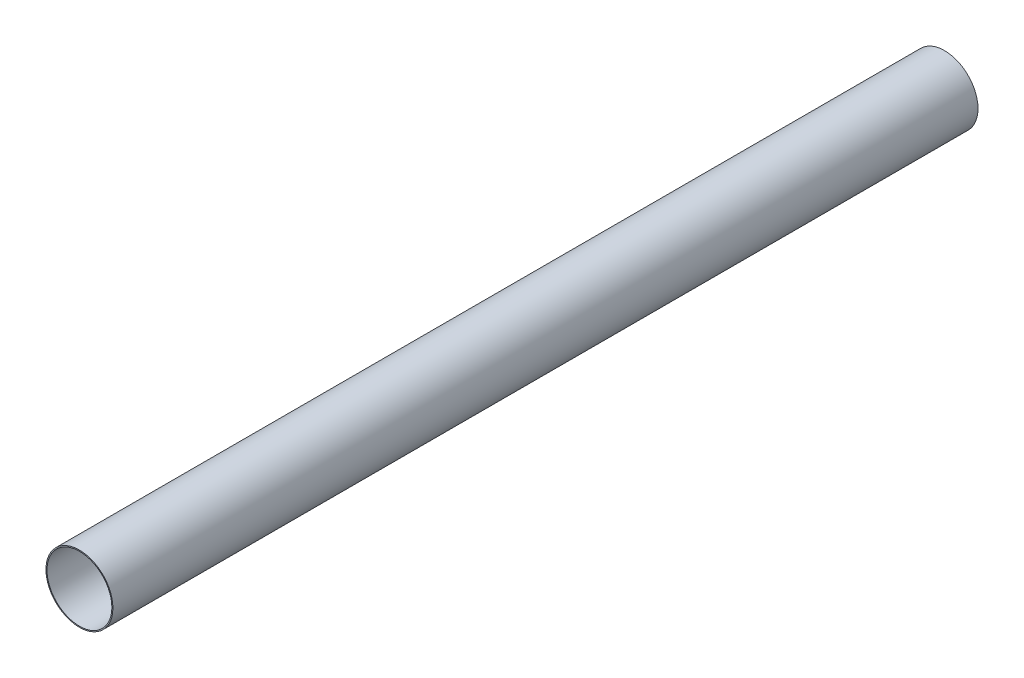
ISO-10303-21;
HEADER;
FILE_DESCRIPTION(('STEP AP214'),'2;1');
FILE_NAME('part.step','',(''),(''),'','','');
FILE_SCHEMA(('AUTOMOTIVE_DESIGN { 1 0 10303 214 1 1 1 1 }'));
ENDSEC;
DATA;
#1=APPLICATION_CONTEXT('core data for automotive mechanical design processes');
#2=APPLICATION_PROTOCOL_DEFINITION('international standard','automotive_design',2000,#1);
#3=PRODUCT_CONTEXT('',#1,'mechanical');
#4=PRODUCT('Part','Part','',(#3));
#5=PRODUCT_RELATED_PRODUCT_CATEGORY('part','',(#4));
#6=PRODUCT_DEFINITION_FORMATION('','',#4);
#7=PRODUCT_DEFINITION_CONTEXT('part definition',#1,'design');
#8=PRODUCT_DEFINITION('design','',#6,#7);
#9=PRODUCT_DEFINITION_SHAPE('','',#8);
#10=(LENGTH_UNIT() NAMED_UNIT(*) SI_UNIT(.MILLI.,.METRE.));
#11=(NAMED_UNIT(*) PLANE_ANGLE_UNIT() SI_UNIT($,.RADIAN.));
#12=(NAMED_UNIT(*) SI_UNIT($,.STERADIAN.) SOLID_ANGLE_UNIT());
#13=UNCERTAINTY_MEASURE_WITH_UNIT(LENGTH_MEASURE(1.E-05),#10,'distance_accuracy_value','');
#14=(GEOMETRIC_REPRESENTATION_CONTEXT(3) GLOBAL_UNCERTAINTY_ASSIGNED_CONTEXT((#13)) GLOBAL_UNIT_ASSIGNED_CONTEXT((#10,
#11,#12)) REPRESENTATION_CONTEXT('',''));
#15=CARTESIAN_POINT('',(0.,0.,0.));
#16=DIRECTION('',(0.,0.,1.));
#17=DIRECTION('',(1.,0.,0.));
#18=AXIS2_PLACEMENT_3D('',#15,#16,#17);
#19=CARTESIAN_POINT('',(0.,0.,1320.8));
#20=DIRECTION('',(0.,0.,1.));
#21=DIRECTION('',(1.,0.,0.));
#22=AXIS2_PLACEMENT_3D('',#19,#20,#21);
#23=PLANE('',#22);
#24=CARTESIAN_POINT('',(0.,0.,1320.8));
#25=DIRECTION('',(0.,0.,1.));
#26=DIRECTION('',(1.,0.,0.));
#27=AXIS2_PLACEMENT_3D('',#24,#25,#26);
#28=CIRCLE('',#27,51.1175);
#29=CARTESIAN_POINT('',(51.1175,0.,1320.8));
#30=VERTEX_POINT('',#29);
#31=EDGE_CURVE('E10',#30,#30,#28,.T.);
#32=ORIENTED_EDGE('',*,*,#31,.T.);
#33=EDGE_LOOP('',(#32));
#34=FACE_BOUND('',#33,.T.);
#35=CARTESIAN_POINT('',(0.,0.,1320.8));
#36=DIRECTION('',(0.,0.,1.));
#37=DIRECTION('',(1.,0.,0.));
#38=AXIS2_PLACEMENT_3D('',#35,#36,#37);
#39=CIRCLE('',#38,49.53);
#40=CARTESIAN_POINT('',(49.53,0.,1320.8));
#41=VERTEX_POINT('',#40);
#42=EDGE_CURVE('E42',#41,#41,#39,.T.);
#43=ORIENTED_EDGE('',*,*,#42,.F.);
#44=EDGE_LOOP('',(#43));
#45=FACE_BOUND('',#44,.T.);
#46=ADVANCED_FACE('F31',(#34,#45),#23,.T.);
#47=CARTESIAN_POINT('',(0.,0.,0.));
#48=DIRECTION('',(0.,0.,1.));
#49=DIRECTION('',(1.,0.,0.));
#50=AXIS2_PLACEMENT_3D('',#47,#48,#49);
#51=PLANE('',#50);
#52=CARTESIAN_POINT('',(0.,0.,0.));
#53=DIRECTION('',(0.,0.,1.));
#54=DIRECTION('',(1.,0.,0.));
#55=AXIS2_PLACEMENT_3D('',#52,#53,#54);
#56=CIRCLE('',#55,51.1175);
#57=CARTESIAN_POINT('',(51.1175,0.,0.));
#58=VERTEX_POINT('',#57);
#59=EDGE_CURVE('E35',#58,#58,#56,.T.);
#60=ORIENTED_EDGE('',*,*,#59,.F.);
#61=EDGE_LOOP('',(#60));
#62=FACE_BOUND('',#61,.T.);
#63=CARTESIAN_POINT('',(0.,0.,0.));
#64=DIRECTION('',(0.,0.,1.));
#65=DIRECTION('',(1.,0.,0.));
#66=AXIS2_PLACEMENT_3D('',#63,#64,#65);
#67=CIRCLE('',#66,49.53);
#68=CARTESIAN_POINT('',(49.53,0.,0.));
#69=VERTEX_POINT('',#68);
#70=EDGE_CURVE('E44',#69,#69,#67,.T.);
#71=ORIENTED_EDGE('',*,*,#70,.T.);
#72=EDGE_LOOP('',(#71));
#73=FACE_BOUND('',#72,.T.);
#74=ADVANCED_FACE('F54',(#62,#73),#51,.F.);
#75=CARTESIAN_POINT('',(0.,0.,1320.8));
#76=DIRECTION('',(0.,0.,-1.));
#77=DIRECTION('',(-1.,0.,0.));
#78=AXIS2_PLACEMENT_3D('',#75,#76,#77);
#79=CYLINDRICAL_SURFACE('',#78,51.1175);
#80=ORIENTED_EDGE('',*,*,#31,.F.);
#81=EDGE_LOOP('',(#80));
#82=FACE_BOUND('',#81,.T.);
#83=ORIENTED_EDGE('',*,*,#59,.T.);
#84=EDGE_LOOP('',(#83));
#85=FACE_BOUND('',#84,.T.);
#86=ADVANCED_FACE('F33',(#82,#85),#79,.T.);
#87=CARTESIAN_POINT('',(0.,0.,1320.8));
#88=DIRECTION('',(0.,0.,-1.));
#89=DIRECTION('',(-1.,0.,0.));
#90=AXIS2_PLACEMENT_3D('',#87,#88,#89);
#91=CYLINDRICAL_SURFACE('',#90,49.53);
#92=ORIENTED_EDGE('',*,*,#42,.T.);
#93=EDGE_LOOP('',(#92));
#94=FACE_BOUND('',#93,.T.);
#95=ORIENTED_EDGE('',*,*,#70,.F.);
#96=EDGE_LOOP('',(#95));
#97=FACE_BOUND('',#96,.T.);
#98=ADVANCED_FACE('F50',(#94,#97),#91,.F.);
#99=CLOSED_SHELL('',(#46,#74,#86,#98));
#100=MANIFOLD_SOLID_BREP('B2',#99);
#101=ADVANCED_BREP_SHAPE_REPRESENTATION('',(#18,#100),#14);
#102=SHAPE_DEFINITION_REPRESENTATION(#9,#101);
ENDSEC;
END-ISO-10303-21;
